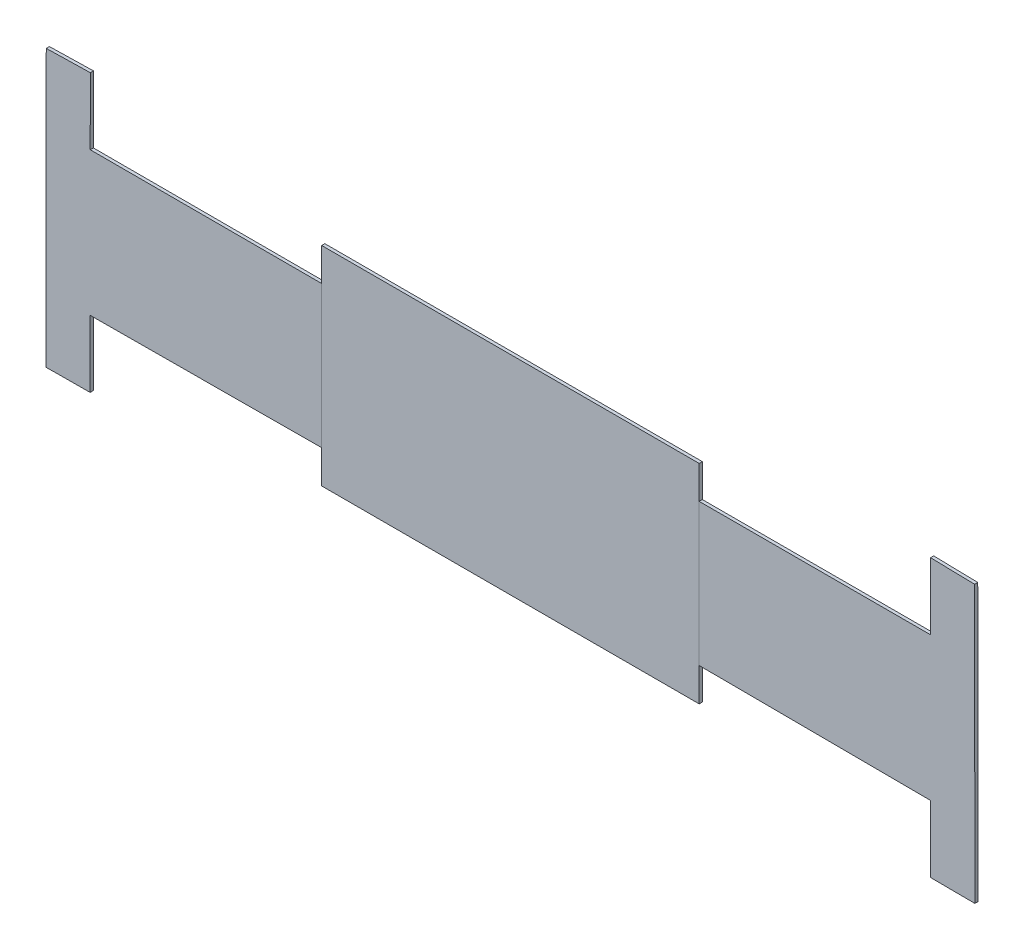
ISO-10303-21;
HEADER;
FILE_DESCRIPTION(('STEP AP214'),'2;1');
FILE_NAME('part.step','',(''),(''),'','','');
FILE_SCHEMA(('AUTOMOTIVE_DESIGN { 1 0 10303 214 1 1 1 1 }'));
ENDSEC;
DATA;
#1=APPLICATION_CONTEXT('core data for automotive mechanical design processes');
#2=APPLICATION_PROTOCOL_DEFINITION('international standard','automotive_design',2000,#1);
#3=PRODUCT_CONTEXT('',#1,'mechanical');
#4=PRODUCT('Part','Part','',(#3));
#5=PRODUCT_RELATED_PRODUCT_CATEGORY('part','',(#4));
#6=PRODUCT_DEFINITION_FORMATION('','',#4);
#7=PRODUCT_DEFINITION_CONTEXT('part definition',#1,'design');
#8=PRODUCT_DEFINITION('design','',#6,#7);
#9=PRODUCT_DEFINITION_SHAPE('','',#8);
#10=(LENGTH_UNIT() NAMED_UNIT(*) SI_UNIT(.MILLI.,.METRE.));
#11=(NAMED_UNIT(*) PLANE_ANGLE_UNIT() SI_UNIT($,.RADIAN.));
#12=(NAMED_UNIT(*) SI_UNIT($,.STERADIAN.) SOLID_ANGLE_UNIT());
#13=UNCERTAINTY_MEASURE_WITH_UNIT(LENGTH_MEASURE(1.E-05),#10,'distance_accuracy_value','');
#14=(GEOMETRIC_REPRESENTATION_CONTEXT(3) GLOBAL_UNCERTAINTY_ASSIGNED_CONTEXT((#13)) GLOBAL_UNIT_ASSIGNED_CONTEXT((#10,
#11,#12)) REPRESENTATION_CONTEXT('',''));
#15=CARTESIAN_POINT('',(0.,0.,0.));
#16=DIRECTION('',(0.,0.,1.));
#17=DIRECTION('',(1.,0.,0.));
#18=AXIS2_PLACEMENT_3D('',#15,#16,#17);
#19=CARTESIAN_POINT('',(191.496220464674,114.960867692272,87.1391620917928));
#20=DIRECTION('',(-0.99999957981213,-0.000916720002634513,0.));
#21=DIRECTION('',(0.000916720002634513,-0.99999957981213,0.));
#22=AXIS2_PLACEMENT_3D('',#19,#20,#21);
#23=PLANE('',#22);
#24=DIRECTION('',(-0.000916720002634517,0.99999957981213,0.));
#25=VECTOR('',#24,1.);
#26=CARTESIAN_POINT('',(191.496220464674,114.960867692272,86.1391620917928));
#27=LINE('',#26,#25);
#28=CARTESIAN_POINT('',(191.576741023194,27.1254059870341,86.1391620917928));
#29=VERTEX_POINT('',#28);
#30=CARTESIAN_POINT('',(191.496220464674,114.960867692272,86.1391620917928));
#31=VERTEX_POINT('',#30);
#32=EDGE_CURVE('P0_E111',#29,#31,#27,.T.);
#33=ORIENTED_EDGE('',*,*,#32,.T.);
#34=DIRECTION('',(0.,0.,-1.));
#35=VECTOR('',#34,1.);
#36=CARTESIAN_POINT('',(191.496220464674,114.960867692272,87.1391620917928));
#37=LINE('',#36,#35);
#38=CARTESIAN_POINT('',(191.496220464674,114.960867692272,87.1391620917928));
#39=VERTEX_POINT('',#38);
#40=EDGE_CURVE('P0_E10',#39,#31,#37,.T.);
#41=ORIENTED_EDGE('',*,*,#40,.F.);
#42=DIRECTION('',(-0.000916720002634517,0.99999957981213,0.));
#43=VECTOR('',#42,1.);
#44=CARTESIAN_POINT('',(191.496220464674,114.960867692272,87.1391620917928));
#45=LINE('',#44,#43);
#46=CARTESIAN_POINT('',(191.576741023194,27.1254059870341,87.1391620917928));
#47=VERTEX_POINT('',#46);
#48=EDGE_CURVE('P0_E125',#47,#39,#45,.T.);
#49=ORIENTED_EDGE('',*,*,#48,.F.);
#50=DIRECTION('',(0.,0.,-1.));
#51=VECTOR('',#50,1.);
#52=CARTESIAN_POINT('',(191.576741023194,27.1254059870341,87.1391620917928));
#53=LINE('',#52,#51);
#54=EDGE_CURVE('P0_E107',#47,#29,#53,.T.);
#55=ORIENTED_EDGE('',*,*,#54,.T.);
#56=EDGE_LOOP('',(#33,#41,#49,#55));
#57=FACE_BOUND('',#56,.T.);
#58=ADVANCED_FACE('P0_F15',(#57),#23,.F.);
#59=CARTESIAN_POINT('',(191.496220464674,114.960867692272,87.1391620917928));
#60=DIRECTION('',(-0.0225589289900871,-0.999745514980097,0.));
#61=DIRECTION('',(0.999745514980098,-0.0225589289900871,0.));
#62=AXIS2_PLACEMENT_3D('',#59,#60,#61);
#63=PLANE('',#62);
#64=DIRECTION('',(-0.999745514980097,0.0225589289900871,0.));
#65=VECTOR('',#64,1.);
#66=CARTESIAN_POINT('',(191.496220464674,114.960867692272,86.1391620917928));
#67=LINE('',#66,#65);
#68=CARTESIAN_POINT('',(177.501190790055,115.276660937566,86.1391620917928));
#69=VERTEX_POINT('',#68);
#70=EDGE_CURVE('P0_E114',#31,#69,#67,.T.);
#71=ORIENTED_EDGE('',*,*,#70,.T.);
#72=DIRECTION('',(0.,0.,-1.));
#73=VECTOR('',#72,1.);
#74=CARTESIAN_POINT('',(177.501190790055,115.276660937566,87.1391620917928));
#75=LINE('',#74,#73);
#76=CARTESIAN_POINT('',(177.501190790055,115.276660937566,87.1391620917928));
#77=VERTEX_POINT('',#76);
#78=EDGE_CURVE('P0_E23',#77,#69,#75,.T.);
#79=ORIENTED_EDGE('',*,*,#78,.F.);
#80=DIRECTION('',(-0.999745514980097,0.0225589289900871,0.));
#81=VECTOR('',#80,1.);
#82=CARTESIAN_POINT('',(191.496220464674,114.960867692272,87.1391620917928));
#83=LINE('',#82,#81);
#84=EDGE_CURVE('P0_E74',#39,#77,#83,.T.);
#85=ORIENTED_EDGE('',*,*,#84,.F.);
#86=ORIENTED_EDGE('',*,*,#40,.T.);
#87=EDGE_LOOP('',(#71,#79,#85,#86));
#88=FACE_BOUND('',#87,.T.);
#89=ADVANCED_FACE('P0_F160',(#88),#63,.F.);
#90=CARTESIAN_POINT('',(177.501190790055,115.276660937566,87.1391620917928));
#91=DIRECTION('',(0.999999850002585,0.000547717817411489,0.));
#92=DIRECTION('',(-0.000547717817411489,0.999999850002585,0.));
#93=AXIS2_PLACEMENT_3D('',#90,#91,#92);
#94=PLANE('',#93);
#95=DIRECTION('',(0.000547717817411492,-0.999999850002585,0.));
#96=VECTOR('',#95,1.);
#97=CARTESIAN_POINT('',(177.501190790055,115.276660937566,86.1391620917928));
#98=LINE('',#97,#96);
#99=CARTESIAN_POINT('',(177.512817781832,94.0485948365083,86.1391620917928));
#100=VERTEX_POINT('',#99);
#101=EDGE_CURVE('P0_E116',#69,#100,#98,.T.);
#102=ORIENTED_EDGE('',*,*,#101,.T.);
#103=DIRECTION('',(0.,0.,-1.));
#104=VECTOR('',#103,1.);
#105=CARTESIAN_POINT('',(177.512817781832,94.0485948365083,87.1391620917928));
#106=LINE('',#105,#104);
#107=CARTESIAN_POINT('',(177.512817781832,94.0485948365083,87.1391620917928));
#108=VERTEX_POINT('',#107);
#109=EDGE_CURVE('P0_E132',#108,#100,#106,.T.);
#110=ORIENTED_EDGE('',*,*,#109,.F.);
#111=DIRECTION('',(0.000547717817411492,-0.999999850002585,0.));
#112=VECTOR('',#111,1.);
#113=CARTESIAN_POINT('',(177.501190790055,115.276660937566,87.1391620917928));
#114=LINE('',#113,#112);
#115=EDGE_CURVE('P0_E140',#77,#108,#114,.T.);
#116=ORIENTED_EDGE('',*,*,#115,.F.);
#117=ORIENTED_EDGE('',*,*,#78,.T.);
#118=EDGE_LOOP('',(#102,#110,#116,#117));
#119=FACE_BOUND('',#118,.T.);
#120=ADVANCED_FACE('P0_F138',(#119),#94,.F.);
#121=CARTESIAN_POINT('',(177.512817781832,94.0485948365083,87.1391620917928));
#122=DIRECTION('',(0.000547717817411621,-0.999999850002585,0.));
#123=DIRECTION('',(0.999999850002585,0.000547717817411621,0.));
#124=AXIS2_PLACEMENT_3D('',#121,#122,#123);
#125=PLANE('',#124);
#126=DIRECTION('',(-0.999999850002585,-0.000547717817411621,0.));
#127=VECTOR('',#126,1.);
#128=CARTESIAN_POINT('',(177.512817781832,94.0485948365083,86.1391620917928));
#129=LINE('',#128,#127);
#130=CARTESIAN_POINT('',(103.929383931383,94.0082918726768,86.1391620917928));
#131=VERTEX_POINT('',#130);
#132=EDGE_CURVE('P0_E118',#100,#131,#129,.T.);
#133=ORIENTED_EDGE('',*,*,#132,.T.);
#134=DIRECTION('',(0.,0.,-1.));
#135=VECTOR('',#134,1.);
#136=CARTESIAN_POINT('',(103.929383931383,94.0082918726768,87.1391620917928));
#137=LINE('',#136,#135);
#138=CARTESIAN_POINT('',(103.929383931383,94.0082918726768,87.1391620917928));
#139=VERTEX_POINT('',#138);
#140=EDGE_CURVE('P0_E129',#139,#131,#137,.T.);
#141=ORIENTED_EDGE('',*,*,#140,.F.);
#142=DIRECTION('',(-0.999999850002585,-0.000547717817411621,0.));
#143=VECTOR('',#142,1.);
#144=CARTESIAN_POINT('',(177.512817781832,94.0485948365083,87.1391620917928));
#145=LINE('',#144,#143);
#146=EDGE_CURVE('P0_E152',#108,#139,#145,.T.);
#147=ORIENTED_EDGE('',*,*,#146,.F.);
#148=ORIENTED_EDGE('',*,*,#109,.T.);
#149=EDGE_LOOP('',(#133,#141,#147,#148));
#150=FACE_BOUND('',#149,.T.);
#151=ADVANCED_FACE('P0_F148',(#150),#125,.F.);
#152=CARTESIAN_POINT('',(103.929383931383,48.813255757817,87.1391620917928));
#153=DIRECTION('',(1.,0.,0.));
#154=DIRECTION('',(0.,1.,0.));
#155=AXIS2_PLACEMENT_3D('',#152,#153,#154);
#156=PLANE('',#155);
#157=DIRECTION('',(0.,-1.,0.));
#158=VECTOR('',#157,1.);
#159=CARTESIAN_POINT('',(103.929383931383,48.813255757817,86.1391620917928));
#160=LINE('',#159,#158);
#161=CARTESIAN_POINT('',(103.929383931383,48.813255757817,86.1391620917928));
#162=VERTEX_POINT('',#161);
#163=EDGE_CURVE('P0_E120',#131,#162,#160,.T.);
#164=ORIENTED_EDGE('',*,*,#163,.T.);
#165=DIRECTION('',(0.,0.,-1.));
#166=VECTOR('',#165,1.);
#167=CARTESIAN_POINT('',(103.929383931383,48.813255757817,87.1391620917928));
#168=LINE('',#167,#166);
#169=CARTESIAN_POINT('',(103.929383931383,48.813255757817,87.1391620917928));
#170=VERTEX_POINT('',#169);
#171=EDGE_CURVE('P0_E102',#170,#162,#168,.T.);
#172=ORIENTED_EDGE('',*,*,#171,.F.);
#173=DIRECTION('',(0.,-1.,0.));
#174=VECTOR('',#173,1.);
#175=CARTESIAN_POINT('',(103.929383931383,48.813255757817,87.1391620917928));
#176=LINE('',#175,#174);
#177=EDGE_CURVE('P0_E93',#139,#170,#176,.T.);
#178=ORIENTED_EDGE('',*,*,#177,.F.);
#179=ORIENTED_EDGE('',*,*,#140,.T.);
#180=EDGE_LOOP('',(#164,#172,#178,#179));
#181=FACE_BOUND('',#180,.T.);
#182=ADVANCED_FACE('P0_F151',(#181),#156,.F.);
#183=CARTESIAN_POINT('',(177.511900365374,48.4436116131279,87.1391620917928));
#184=DIRECTION('',(0.00502346886929363,0.999987382300657,0.));
#185=DIRECTION('',(-0.999987382300657,0.00502346886929363,0.));
#186=AXIS2_PLACEMENT_3D('',#183,#184,#185);
#187=PLANE('',#186);
#188=DIRECTION('',(0.999987382300657,-0.00502346886929364,0.));
#189=VECTOR('',#188,1.);
#190=CARTESIAN_POINT('',(177.511900365374,48.4436116131279,86.1391620917928));
#191=LINE('',#190,#189);
#192=CARTESIAN_POINT('',(177.511900365374,48.4436116131279,86.1391620917928));
#193=VERTEX_POINT('',#192);
#194=EDGE_CURVE('P0_E101',#162,#193,#191,.T.);
#195=ORIENTED_EDGE('',*,*,#194,.T.);
#196=DIRECTION('',(0.,0.,-1.));
#197=VECTOR('',#196,1.);
#198=CARTESIAN_POINT('',(177.511900365374,48.4436116131279,87.1391620917928));
#199=LINE('',#198,#197);
#200=CARTESIAN_POINT('',(177.511900365374,48.4436116131279,87.1391620917928));
#201=VERTEX_POINT('',#200);
#202=EDGE_CURVE('P0_E98',#201,#193,#199,.T.);
#203=ORIENTED_EDGE('',*,*,#202,.F.);
#204=DIRECTION('',(0.999987382300657,-0.00502346886929364,0.));
#205=VECTOR('',#204,1.);
#206=CARTESIAN_POINT('',(177.511900365374,48.4436116131279,87.1391620917928));
#207=LINE('',#206,#205);
#208=EDGE_CURVE('P0_E87',#170,#201,#207,.T.);
#209=ORIENTED_EDGE('',*,*,#208,.F.);
#210=ORIENTED_EDGE('',*,*,#171,.T.);
#211=EDGE_LOOP('',(#195,#203,#209,#210));
#212=FACE_BOUND('',#211,.T.);
#213=ADVANCED_FACE('P0_F99',(#212),#187,.F.);
#214=CARTESIAN_POINT('',(177.511900365374,48.4436116131279,87.1391620917928));
#215=DIRECTION('',(0.999998836837268,0.00152522919924042,0.));
#216=DIRECTION('',(-0.00152522919924043,0.999998836837269,0.));
#217=AXIS2_PLACEMENT_3D('',#214,#215,#216);
#218=PLANE('',#217);
#219=DIRECTION('',(0.00152522919924042,-0.999998836837269,0.));
#220=VECTOR('',#219,1.);
#221=CARTESIAN_POINT('',(177.511900365374,48.4436116131279,86.1391620917928));
#222=LINE('',#221,#220);
#223=CARTESIAN_POINT('',(177.544278036491,27.2155670196134,86.1391620917928));
#224=VERTEX_POINT('',#223);
#225=EDGE_CURVE('P0_E60',#193,#224,#222,.T.);
#226=ORIENTED_EDGE('',*,*,#225,.T.);
#227=DIRECTION('',(0.,0.,-1.));
#228=VECTOR('',#227,1.);
#229=CARTESIAN_POINT('',(177.544278036491,27.2155670196134,87.1391620917928));
#230=LINE('',#229,#228);
#231=CARTESIAN_POINT('',(177.544278036491,27.2155670196134,87.1391620917928));
#232=VERTEX_POINT('',#231);
#233=EDGE_CURVE('P0_E103',#232,#224,#230,.T.);
#234=ORIENTED_EDGE('',*,*,#233,.F.);
#235=DIRECTION('',(0.00152522919924042,-0.999998836837269,0.));
#236=VECTOR('',#235,1.);
#237=CARTESIAN_POINT('',(177.511900365374,48.4436116131279,87.1391620917928));
#238=LINE('',#237,#236);
#239=EDGE_CURVE('P0_E91',#201,#232,#238,.T.);
#240=ORIENTED_EDGE('',*,*,#239,.F.);
#241=ORIENTED_EDGE('',*,*,#202,.T.);
#242=EDGE_LOOP('',(#226,#234,#240,#241));
#243=FACE_BOUND('',#242,.T.);
#244=ADVANCED_FACE('P0_F105',(#243),#218,.F.);
#245=CARTESIAN_POINT('',(191.576741023194,27.1254059870341,87.1391620917928));
#246=DIRECTION('',(0.00642504253665458,0.99997935920118,0.));
#247=DIRECTION('',(-0.99997935920118,0.00642504253665458,0.));
#248=AXIS2_PLACEMENT_3D('',#245,#246,#247);
#249=PLANE('',#248);
#250=DIRECTION('',(0.99997935920118,-0.00642504253665458,0.));
#251=VECTOR('',#250,1.);
#252=CARTESIAN_POINT('',(191.576741023194,27.1254059870341,86.1391620917928));
#253=LINE('',#252,#251);
#254=EDGE_CURVE('P0_E66',#224,#29,#253,.T.);
#255=ORIENTED_EDGE('',*,*,#254,.T.);
#256=ORIENTED_EDGE('',*,*,#54,.F.);
#257=DIRECTION('',(0.99997935920118,-0.00642504253665458,0.));
#258=VECTOR('',#257,1.);
#259=CARTESIAN_POINT('',(191.576741023194,27.1254059870341,87.1391620917928));
#260=LINE('',#259,#258);
#261=EDGE_CURVE('P0_E31',#232,#47,#260,.T.);
#262=ORIENTED_EDGE('',*,*,#261,.F.);
#263=ORIENTED_EDGE('',*,*,#233,.T.);
#264=EDGE_LOOP('',(#255,#256,#262,#263));
#265=FACE_BOUND('',#264,.T.);
#266=ADVANCED_FACE('P0_F177',(#265),#249,.F.);
#267=CARTESIAN_POINT('',(163.847905712595,60.9702408178997,87.1391620917928));
#268=DIRECTION('',(0.,0.,-1.));
#269=DIRECTION('',(-0.999711247450155,-0.0240296009466376,0.));
#270=AXIS2_PLACEMENT_3D('',#267,#268,#269);
#271=PLANE('',#270);
#272=ORIENTED_EDGE('',*,*,#48,.T.);
#273=ORIENTED_EDGE('',*,*,#84,.T.);
#274=ORIENTED_EDGE('',*,*,#115,.T.);
#275=ORIENTED_EDGE('',*,*,#146,.T.);
#276=ORIENTED_EDGE('',*,*,#177,.T.);
#277=ORIENTED_EDGE('',*,*,#208,.T.);
#278=ORIENTED_EDGE('',*,*,#239,.T.);
#279=ORIENTED_EDGE('',*,*,#261,.T.);
#280=EDGE_LOOP('',(#272,#273,#274,#275,#276,#277,#278,#279));
#281=FACE_BOUND('',#280,.T.);
#282=ADVANCED_FACE('P0_F89',(#281),#271,.F.);
#283=CARTESIAN_POINT('',(163.847905712595,60.9702408178997,86.1391620917928));
#284=DIRECTION('',(0.,0.,-1.));
#285=DIRECTION('',(-0.999711247450155,-0.0240296009466376,0.));
#286=AXIS2_PLACEMENT_3D('',#283,#284,#285);
#287=PLANE('',#286);
#288=ORIENTED_EDGE('',*,*,#32,.F.);
#289=ORIENTED_EDGE('',*,*,#254,.F.);
#290=ORIENTED_EDGE('',*,*,#225,.F.);
#291=ORIENTED_EDGE('',*,*,#194,.F.);
#292=ORIENTED_EDGE('',*,*,#163,.F.);
#293=ORIENTED_EDGE('',*,*,#132,.F.);
#294=ORIENTED_EDGE('',*,*,#101,.F.);
#295=ORIENTED_EDGE('',*,*,#70,.F.);
#296=EDGE_LOOP('',(#288,#289,#290,#291,#292,#293,#294,#295));
#297=FACE_BOUND('',#296,.T.);
#298=ADVANCED_FACE('P0_F144',(#297),#287,.T.);
#299=CLOSED_SHELL('',(#58,#89,#120,#151,#182,#213,#244,#266,#282,#298));
#300=MANIFOLD_SOLID_BREP('P0_B1',#299);
#301=CARTESIAN_POINT('',(-103.637452601907,114.933589519347,86.1391620917928));
#302=DIRECTION('',(0.99999957981213,-0.000916720002634517,0.));
#303=DIRECTION('',(-0.000916720002634517,-0.99999957981213,0.));
#304=AXIS2_PLACEMENT_3D('',#301,#302,#303);
#305=PLANE('',#304);
#306=DIRECTION('',(0.00091672000263452,0.99999957981213,0.));
#307=VECTOR('',#306,1.);
#308=CARTESIAN_POINT('',(-103.637452601907,114.933589519347,87.1391620917928));
#309=LINE('',#308,#307);
#310=CARTESIAN_POINT('',(-103.717973160427,27.098127814109,87.1391620917928));
#311=VERTEX_POINT('',#310);
#312=CARTESIAN_POINT('',(-103.637452601907,114.933589519347,87.1391620917928));
#313=VERTEX_POINT('',#312);
#314=EDGE_CURVE('P1_E112',#311,#313,#309,.T.);
#315=ORIENTED_EDGE('',*,*,#314,.T.);
#316=DIRECTION('',(0.,0.,1.));
#317=VECTOR('',#316,1.);
#318=CARTESIAN_POINT('',(-103.637452601907,114.933589519347,86.1391620917928));
#319=LINE('',#318,#317);
#320=CARTESIAN_POINT('',(-103.637452601907,114.933589519347,86.1391620917928));
#321=VERTEX_POINT('',#320);
#322=EDGE_CURVE('P1_E11',#321,#313,#319,.T.);
#323=ORIENTED_EDGE('',*,*,#322,.F.);
#324=DIRECTION('',(0.00091672000263452,0.99999957981213,0.));
#325=VECTOR('',#324,1.);
#326=CARTESIAN_POINT('',(-103.637452601907,114.933589519347,86.1391620917928));
#327=LINE('',#326,#325);
#328=CARTESIAN_POINT('',(-103.717973160427,27.098127814109,86.1391620917928));
#329=VERTEX_POINT('',#328);
#330=EDGE_CURVE('P1_E126',#329,#321,#327,.T.);
#331=ORIENTED_EDGE('',*,*,#330,.F.);
#332=DIRECTION('',(0.,0.,1.));
#333=VECTOR('',#332,1.);
#334=CARTESIAN_POINT('',(-103.717973160427,27.098127814109,86.1391620917928));
#335=LINE('',#334,#333);
#336=EDGE_CURVE('P1_E108',#329,#311,#335,.T.);
#337=ORIENTED_EDGE('',*,*,#336,.T.);
#338=EDGE_LOOP('',(#315,#323,#331,#337));
#339=FACE_BOUND('',#338,.T.);
#340=ADVANCED_FACE('P1_F16',(#339),#305,.F.);
#341=CARTESIAN_POINT('',(-103.637452601907,114.933589519347,86.1391620917928));
#342=DIRECTION('',(0.0225589289900871,-0.999745514980097,0.));
#343=DIRECTION('',(-0.999745514980098,-0.0225589289900871,0.));
#344=AXIS2_PLACEMENT_3D('',#341,#342,#343);
#345=PLANE('',#344);
#346=DIRECTION('',(0.999745514980097,0.0225589289900871,0.));
#347=VECTOR('',#346,1.);
#348=CARTESIAN_POINT('',(-103.637452601907,114.933589519347,87.1391620917928));
#349=LINE('',#348,#347);
#350=CARTESIAN_POINT('',(-89.642422927288,115.249382764641,87.1391620917928));
#351=VERTEX_POINT('',#350);
#352=EDGE_CURVE('P1_E115',#313,#351,#349,.T.);
#353=ORIENTED_EDGE('',*,*,#352,.T.);
#354=DIRECTION('',(0.,0.,1.));
#355=VECTOR('',#354,1.);
#356=CARTESIAN_POINT('',(-89.642422927288,115.249382764641,86.1391620917928));
#357=LINE('',#356,#355);
#358=CARTESIAN_POINT('',(-89.642422927288,115.249382764641,86.1391620917928));
#359=VERTEX_POINT('',#358);
#360=EDGE_CURVE('P1_E24',#359,#351,#357,.T.);
#361=ORIENTED_EDGE('',*,*,#360,.F.);
#362=DIRECTION('',(0.999745514980097,0.0225589289900871,0.));
#363=VECTOR('',#362,1.);
#364=CARTESIAN_POINT('',(-103.637452601907,114.933589519347,86.1391620917928));
#365=LINE('',#364,#363);
#366=EDGE_CURVE('P1_E75',#321,#359,#365,.T.);
#367=ORIENTED_EDGE('',*,*,#366,.F.);
#368=ORIENTED_EDGE('',*,*,#322,.T.);
#369=EDGE_LOOP('',(#353,#361,#367,#368));
#370=FACE_BOUND('',#369,.T.);
#371=ADVANCED_FACE('P1_F161',(#370),#345,.F.);
#372=CARTESIAN_POINT('',(-89.642422927288,115.249382764641,86.1391620917928));
#373=DIRECTION('',(-0.999999850002585,0.000547717817411496,0.));
#374=DIRECTION('',(0.000547717817411496,0.999999850002585,0.));
#375=AXIS2_PLACEMENT_3D('',#372,#373,#374);
#376=PLANE('',#375);
#377=DIRECTION('',(-0.000547717817411499,-0.999999850002585,0.));
#378=VECTOR('',#377,1.);
#379=CARTESIAN_POINT('',(-89.642422927288,115.249382764641,87.1391620917928));
#380=LINE('',#379,#378);
#381=CARTESIAN_POINT('',(-89.6540499190647,94.0213166635832,87.1391620917928));
#382=VERTEX_POINT('',#381);
#383=EDGE_CURVE('P1_E117',#351,#382,#380,.T.);
#384=ORIENTED_EDGE('',*,*,#383,.T.);
#385=DIRECTION('',(0.,0.,1.));
#386=VECTOR('',#385,1.);
#387=CARTESIAN_POINT('',(-89.6540499190647,94.0213166635832,86.1391620917928));
#388=LINE('',#387,#386);
#389=CARTESIAN_POINT('',(-89.6540499190647,94.0213166635832,86.1391620917928));
#390=VERTEX_POINT('',#389);
#391=EDGE_CURVE('P1_E133',#390,#382,#388,.T.);
#392=ORIENTED_EDGE('',*,*,#391,.F.);
#393=DIRECTION('',(-0.000547717817411499,-0.999999850002585,0.));
#394=VECTOR('',#393,1.);
#395=CARTESIAN_POINT('',(-89.642422927288,115.249382764641,86.1391620917928));
#396=LINE('',#395,#394);
#397=EDGE_CURVE('P1_E141',#359,#390,#396,.T.);
#398=ORIENTED_EDGE('',*,*,#397,.F.);
#399=ORIENTED_EDGE('',*,*,#360,.T.);
#400=EDGE_LOOP('',(#384,#392,#398,#399));
#401=FACE_BOUND('',#400,.T.);
#402=ADVANCED_FACE('P1_F139',(#401),#376,.F.);
#403=CARTESIAN_POINT('',(-89.6540499190647,94.0213166635832,86.1391620917928));
#404=DIRECTION('',(-0.000547717817411628,-0.999999850002585,0.));
#405=DIRECTION('',(-0.999999850002585,0.000547717817411628,0.));
#406=AXIS2_PLACEMENT_3D('',#403,#404,#405);
#407=PLANE('',#406);
#408=DIRECTION('',(0.999999850002585,-0.000547717817411628,0.));
#409=VECTOR('',#408,1.);
#410=CARTESIAN_POINT('',(-89.6540499190647,94.0213166635832,87.1391620917928));
#411=LINE('',#410,#409);
#412=CARTESIAN_POINT('',(-16.0706160686165,93.9810136997517,87.1391620917928));
#413=VERTEX_POINT('',#412);
#414=EDGE_CURVE('P1_E119',#382,#413,#411,.T.);
#415=ORIENTED_EDGE('',*,*,#414,.T.);
#416=DIRECTION('',(0.,0.,1.));
#417=VECTOR('',#416,1.);
#418=CARTESIAN_POINT('',(-16.0706160686165,93.9810136997517,86.1391620917928));
#419=LINE('',#418,#417);
#420=CARTESIAN_POINT('',(-16.0706160686165,93.9810136997517,86.1391620917928));
#421=VERTEX_POINT('',#420);
#422=EDGE_CURVE('P1_E130',#421,#413,#419,.T.);
#423=ORIENTED_EDGE('',*,*,#422,.F.);
#424=DIRECTION('',(0.999999850002585,-0.000547717817411628,0.));
#425=VECTOR('',#424,1.);
#426=CARTESIAN_POINT('',(-89.6540499190647,94.0213166635832,86.1391620917928));
#427=LINE('',#426,#425);
#428=EDGE_CURVE('P1_E153',#390,#421,#427,.T.);
#429=ORIENTED_EDGE('',*,*,#428,.F.);
#430=ORIENTED_EDGE('',*,*,#391,.T.);
#431=EDGE_LOOP('',(#415,#423,#429,#430));
#432=FACE_BOUND('',#431,.T.);
#433=ADVANCED_FACE('P1_F149',(#432),#407,.F.);
#434=CARTESIAN_POINT('',(-16.0706160686165,48.7859775848919,86.1391620917928));
#435=DIRECTION('',(-1.,0.,0.));
#436=DIRECTION('',(0.,1.,0.));
#437=AXIS2_PLACEMENT_3D('',#434,#435,#436);
#438=PLANE('',#437);
#439=DIRECTION('',(0.,-1.,0.));
#440=VECTOR('',#439,1.);
#441=CARTESIAN_POINT('',(-16.0706160686165,48.7859775848919,87.1391620917928));
#442=LINE('',#441,#440);
#443=CARTESIAN_POINT('',(-16.0706160686165,48.7859775848919,87.1391620917928));
#444=VERTEX_POINT('',#443);
#445=EDGE_CURVE('P1_E121',#413,#444,#442,.T.);
#446=ORIENTED_EDGE('',*,*,#445,.T.);
#447=DIRECTION('',(0.,0.,1.));
#448=VECTOR('',#447,1.);
#449=CARTESIAN_POINT('',(-16.0706160686165,48.7859775848919,86.1391620917928));
#450=LINE('',#449,#448);
#451=CARTESIAN_POINT('',(-16.0706160686165,48.7859775848919,86.1391620917928));
#452=VERTEX_POINT('',#451);
#453=EDGE_CURVE('P1_E103',#452,#444,#450,.T.);
#454=ORIENTED_EDGE('',*,*,#453,.F.);
#455=DIRECTION('',(0.,-1.,0.));
#456=VECTOR('',#455,1.);
#457=CARTESIAN_POINT('',(-16.0706160686165,48.7859775848919,86.1391620917928));
#458=LINE('',#457,#456);
#459=EDGE_CURVE('P1_E94',#421,#452,#458,.T.);
#460=ORIENTED_EDGE('',*,*,#459,.F.);
#461=ORIENTED_EDGE('',*,*,#422,.T.);
#462=EDGE_LOOP('',(#446,#454,#460,#461));
#463=FACE_BOUND('',#462,.T.);
#464=ADVANCED_FACE('P1_F152',(#463),#438,.F.);
#465=CARTESIAN_POINT('',(-89.653132502607,48.4163334402028,86.1391620917928));
#466=DIRECTION('',(-0.00502346886929363,0.999987382300657,0.));
#467=DIRECTION('',(0.999987382300657,0.00502346886929363,0.));
#468=AXIS2_PLACEMENT_3D('',#465,#466,#467);
#469=PLANE('',#468);
#470=DIRECTION('',(-0.999987382300656,-0.00502346886929363,0.));
#471=VECTOR('',#470,1.);
#472=CARTESIAN_POINT('',(-89.653132502607,48.4163334402028,87.1391620917928));
#473=LINE('',#472,#471);
#474=CARTESIAN_POINT('',(-89.653132502607,48.4163334402028,87.1391620917928));
#475=VERTEX_POINT('',#474);
#476=EDGE_CURVE('P1_E102',#444,#475,#473,.T.);
#477=ORIENTED_EDGE('',*,*,#476,.T.);
#478=DIRECTION('',(0.,0.,1.));
#479=VECTOR('',#478,1.);
#480=CARTESIAN_POINT('',(-89.653132502607,48.4163334402028,86.1391620917928));
#481=LINE('',#480,#479);
#482=CARTESIAN_POINT('',(-89.653132502607,48.4163334402028,86.1391620917928));
#483=VERTEX_POINT('',#482);
#484=EDGE_CURVE('P1_E99',#483,#475,#481,.T.);
#485=ORIENTED_EDGE('',*,*,#484,.F.);
#486=DIRECTION('',(-0.999987382300656,-0.00502346886929363,0.));
#487=VECTOR('',#486,1.);
#488=CARTESIAN_POINT('',(-89.653132502607,48.4163334402028,86.1391620917928));
#489=LINE('',#488,#487);
#490=EDGE_CURVE('P1_E88',#452,#483,#489,.T.);
#491=ORIENTED_EDGE('',*,*,#490,.F.);
#492=ORIENTED_EDGE('',*,*,#453,.T.);
#493=EDGE_LOOP('',(#477,#485,#491,#492));
#494=FACE_BOUND('',#493,.T.);
#495=ADVANCED_FACE('P1_F100',(#494),#469,.F.);
#496=CARTESIAN_POINT('',(-89.653132502607,48.4163334402028,86.1391620917928));
#497=DIRECTION('',(-0.999998836837268,0.00152522919924043,0.));
#498=DIRECTION('',(0.00152522919924043,0.999998836837269,0.));
#499=AXIS2_PLACEMENT_3D('',#496,#497,#498);
#500=PLANE('',#499);
#501=DIRECTION('',(-0.00152522919924043,-0.999998836837269,0.));
#502=VECTOR('',#501,1.);
#503=CARTESIAN_POINT('',(-89.653132502607,48.4163334402028,87.1391620917928));
#504=LINE('',#503,#502);
#505=CARTESIAN_POINT('',(-89.6855101737243,27.1882888466883,87.1391620917928));
#506=VERTEX_POINT('',#505);
#507=EDGE_CURVE('P1_E61',#475,#506,#504,.T.);
#508=ORIENTED_EDGE('',*,*,#507,.T.);
#509=DIRECTION('',(0.,0.,1.));
#510=VECTOR('',#509,1.);
#511=CARTESIAN_POINT('',(-89.6855101737243,27.1882888466883,86.1391620917928));
#512=LINE('',#511,#510);
#513=CARTESIAN_POINT('',(-89.6855101737243,27.1882888466883,86.1391620917928));
#514=VERTEX_POINT('',#513);
#515=EDGE_CURVE('P1_E104',#514,#506,#512,.T.);
#516=ORIENTED_EDGE('',*,*,#515,.F.);
#517=DIRECTION('',(-0.00152522919924043,-0.999998836837269,0.));
#518=VECTOR('',#517,1.);
#519=CARTESIAN_POINT('',(-89.653132502607,48.4163334402028,86.1391620917928));
#520=LINE('',#519,#518);
#521=EDGE_CURVE('P1_E92',#483,#514,#520,.T.);
#522=ORIENTED_EDGE('',*,*,#521,.F.);
#523=ORIENTED_EDGE('',*,*,#484,.T.);
#524=EDGE_LOOP('',(#508,#516,#522,#523));
#525=FACE_BOUND('',#524,.T.);
#526=ADVANCED_FACE('P1_F106',(#525),#500,.F.);
#527=CARTESIAN_POINT('',(-103.717973160427,27.098127814109,86.1391620917928));
#528=DIRECTION('',(-0.00642504253665457,0.99997935920118,0.));
#529=DIRECTION('',(0.99997935920118,0.00642504253665457,0.));
#530=AXIS2_PLACEMENT_3D('',#527,#528,#529);
#531=PLANE('',#530);
#532=DIRECTION('',(-0.99997935920118,-0.00642504253665457,0.));
#533=VECTOR('',#532,1.);
#534=CARTESIAN_POINT('',(-103.717973160427,27.098127814109,87.1391620917928));
#535=LINE('',#534,#533);
#536=EDGE_CURVE('P1_E67',#506,#311,#535,.T.);
#537=ORIENTED_EDGE('',*,*,#536,.T.);
#538=ORIENTED_EDGE('',*,*,#336,.F.);
#539=DIRECTION('',(-0.99997935920118,-0.00642504253665457,0.));
#540=VECTOR('',#539,1.);
#541=CARTESIAN_POINT('',(-103.717973160427,27.098127814109,86.1391620917928));
#542=LINE('',#541,#540);
#543=EDGE_CURVE('P1_E32',#514,#329,#542,.T.);
#544=ORIENTED_EDGE('',*,*,#543,.F.);
#545=ORIENTED_EDGE('',*,*,#515,.T.);
#546=EDGE_LOOP('',(#537,#538,#544,#545));
#547=FACE_BOUND('',#546,.T.);
#548=ADVANCED_FACE('P1_F178',(#547),#531,.F.);
#549=CARTESIAN_POINT('',(-75.9891378498279,60.9429626449746,86.1391620917928));
#550=DIRECTION('',(0.,0.,1.));
#551=DIRECTION('',(0.999711247450155,-0.0240296009466376,0.));
#552=AXIS2_PLACEMENT_3D('',#549,#550,#551);
#553=PLANE('',#552);
#554=ORIENTED_EDGE('',*,*,#330,.T.);
#555=ORIENTED_EDGE('',*,*,#366,.T.);
#556=ORIENTED_EDGE('',*,*,#397,.T.);
#557=ORIENTED_EDGE('',*,*,#428,.T.);
#558=ORIENTED_EDGE('',*,*,#459,.T.);
#559=ORIENTED_EDGE('',*,*,#490,.T.);
#560=ORIENTED_EDGE('',*,*,#521,.T.);
#561=ORIENTED_EDGE('',*,*,#543,.T.);
#562=EDGE_LOOP('',(#554,#555,#556,#557,#558,#559,#560,#561));
#563=FACE_BOUND('',#562,.T.);
#564=ADVANCED_FACE('P1_F90',(#563),#553,.F.);
#565=CARTESIAN_POINT('',(-75.9891378498279,60.9429626449746,87.1391620917928));
#566=DIRECTION('',(0.,0.,1.));
#567=DIRECTION('',(0.999711247450155,-0.0240296009466376,0.));
#568=AXIS2_PLACEMENT_3D('',#565,#566,#567);
#569=PLANE('',#568);
#570=ORIENTED_EDGE('',*,*,#314,.F.);
#571=ORIENTED_EDGE('',*,*,#536,.F.);
#572=ORIENTED_EDGE('',*,*,#507,.F.);
#573=ORIENTED_EDGE('',*,*,#476,.F.);
#574=ORIENTED_EDGE('',*,*,#445,.F.);
#575=ORIENTED_EDGE('',*,*,#414,.F.);
#576=ORIENTED_EDGE('',*,*,#383,.F.);
#577=ORIENTED_EDGE('',*,*,#352,.F.);
#578=EDGE_LOOP('',(#570,#571,#572,#573,#574,#575,#576,#577));
#579=FACE_BOUND('',#578,.T.);
#580=ADVANCED_FACE('P1_F145',(#579),#569,.T.);
#581=CLOSED_SHELL('',(#340,#371,#402,#433,#464,#495,#526,#548,#564,#580));
#582=MANIFOLD_SOLID_BREP('P1_B1',#581);
#583=CARTESIAN_POINT('',(103.929383931383,38.2392812998555,87.1391620917928));
#584=DIRECTION('',(0.,1.,0.));
#585=DIRECTION('',(-1.,0.,0.));
#586=AXIS2_PLACEMENT_3D('',#583,#584,#585);
#587=PLANE('',#586);
#588=DIRECTION('',(1.,0.,0.));
#589=VECTOR('',#588,1.);
#590=CARTESIAN_POINT('',(103.929383931383,38.2392812998555,86.1391620917928));
#591=LINE('',#590,#589);
#592=CARTESIAN_POINT('',(-16.0706160686165,38.2392812998555,86.1391620917928));
#593=VERTEX_POINT('',#592);
#594=CARTESIAN_POINT('',(103.929383931383,38.2392812998555,86.1391620917928));
#595=VERTEX_POINT('',#594);
#596=EDGE_CURVE('P2_E79',#593,#595,#591,.T.);
#597=ORIENTED_EDGE('',*,*,#596,.T.);
#598=DIRECTION('',(0.,0.,-1.));
#599=VECTOR('',#598,1.);
#600=CARTESIAN_POINT('',(103.929383931383,38.2392812998555,87.1391620917928));
#601=LINE('',#600,#599);
#602=CARTESIAN_POINT('',(103.929383931383,38.2392812998555,87.1391620917928));
#603=VERTEX_POINT('',#602);
#604=EDGE_CURVE('P2_E11',#603,#595,#601,.T.);
#605=ORIENTED_EDGE('',*,*,#604,.F.);
#606=DIRECTION('',(1.,0.,0.));
#607=VECTOR('',#606,1.);
#608=CARTESIAN_POINT('',(103.929383931383,38.2392812998555,87.1391620917928));
#609=LINE('',#608,#607);
#610=CARTESIAN_POINT('',(-16.0706160686165,38.2392812998555,87.1391620917928));
#611=VERTEX_POINT('',#610);
#612=EDGE_CURVE('P2_E67',#611,#603,#609,.T.);
#613=ORIENTED_EDGE('',*,*,#612,.F.);
#614=DIRECTION('',(0.,0.,-1.));
#615=VECTOR('',#614,1.);
#616=CARTESIAN_POINT('',(-16.0706160686165,38.2392812998555,87.1391620917928));
#617=LINE('',#616,#615);
#618=EDGE_CURVE('P2_E75',#611,#593,#617,.T.);
#619=ORIENTED_EDGE('',*,*,#618,.T.);
#620=EDGE_LOOP('',(#597,#605,#613,#619));
#621=FACE_BOUND('',#620,.T.);
#622=ADVANCED_FACE('P2_F16',(#621),#587,.F.);
#623=CARTESIAN_POINT('',(103.929383931383,104.453118155913,87.1391620917928));
#624=DIRECTION('',(-1.,0.,0.));
#625=DIRECTION('',(0.,0.,1.));
#626=AXIS2_PLACEMENT_3D('',#623,#624,#625);
#627=PLANE('',#626);
#628=DIRECTION('',(0.,1.,0.));
#629=VECTOR('',#628,1.);
#630=CARTESIAN_POINT('',(103.929383931383,104.453118155913,86.1391620917928));
#631=LINE('',#630,#629);
#632=CARTESIAN_POINT('',(103.929383931383,104.453118155913,86.1391620917928));
#633=VERTEX_POINT('',#632);
#634=EDGE_CURVE('P2_E71',#595,#633,#631,.T.);
#635=ORIENTED_EDGE('',*,*,#634,.T.);
#636=DIRECTION('',(0.,0.,-1.));
#637=VECTOR('',#636,1.);
#638=CARTESIAN_POINT('',(103.929383931383,104.453118155913,87.1391620917928));
#639=LINE('',#638,#637);
#640=CARTESIAN_POINT('',(103.929383931383,104.453118155913,87.1391620917928));
#641=VERTEX_POINT('',#640);
#642=EDGE_CURVE('P2_E24',#641,#633,#639,.T.);
#643=ORIENTED_EDGE('',*,*,#642,.F.);
#644=DIRECTION('',(0.,1.,0.));
#645=VECTOR('',#644,1.);
#646=CARTESIAN_POINT('',(103.929383931383,104.453118155913,87.1391620917928));
#647=LINE('',#646,#645);
#648=EDGE_CURVE('P2_E62',#603,#641,#647,.T.);
#649=ORIENTED_EDGE('',*,*,#648,.F.);
#650=ORIENTED_EDGE('',*,*,#604,.T.);
#651=EDGE_LOOP('',(#635,#643,#649,#650));
#652=FACE_BOUND('',#651,.T.);
#653=ADVANCED_FACE('P2_F70',(#652),#627,.F.);
#654=CARTESIAN_POINT('',(-16.0706160686165,104.453118155913,87.1391620917928));
#655=DIRECTION('',(0.,-1.,0.));
#656=DIRECTION('',(0.,0.,-1.));
#657=AXIS2_PLACEMENT_3D('',#654,#655,#656);
#658=PLANE('',#657);
#659=DIRECTION('',(-1.,0.,0.));
#660=VECTOR('',#659,1.);
#661=CARTESIAN_POINT('',(-16.0706160686165,104.453118155913,86.1391620917928));
#662=LINE('',#661,#660);
#663=CARTESIAN_POINT('',(-16.0706160686165,104.453118155913,86.1391620917928));
#664=VERTEX_POINT('',#663);
#665=EDGE_CURVE('P2_E49',#633,#664,#662,.T.);
#666=ORIENTED_EDGE('',*,*,#665,.T.);
#667=DIRECTION('',(0.,0.,-1.));
#668=VECTOR('',#667,1.);
#669=CARTESIAN_POINT('',(-16.0706160686165,104.453118155913,87.1391620917928));
#670=LINE('',#669,#668);
#671=CARTESIAN_POINT('',(-16.0706160686165,104.453118155913,87.1391620917928));
#672=VERTEX_POINT('',#671);
#673=EDGE_CURVE('P2_E72',#672,#664,#670,.T.);
#674=ORIENTED_EDGE('',*,*,#673,.F.);
#675=DIRECTION('',(-1.,0.,0.));
#676=VECTOR('',#675,1.);
#677=CARTESIAN_POINT('',(-16.0706160686165,104.453118155913,87.1391620917928));
#678=LINE('',#677,#676);
#679=EDGE_CURVE('P2_E65',#641,#672,#678,.T.);
#680=ORIENTED_EDGE('',*,*,#679,.F.);
#681=ORIENTED_EDGE('',*,*,#642,.T.);
#682=EDGE_LOOP('',(#666,#674,#680,#681));
#683=FACE_BOUND('',#682,.T.);
#684=ADVANCED_FACE('P2_F73',(#683),#658,.F.);
#685=CARTESIAN_POINT('',(-16.0706160686165,38.2392812998555,87.1391620917928));
#686=DIRECTION('',(1.,0.,0.));
#687=DIRECTION('',(0.,0.,-1.));
#688=AXIS2_PLACEMENT_3D('',#685,#686,#687);
#689=PLANE('',#688);
#690=DIRECTION('',(0.,-1.,0.));
#691=VECTOR('',#690,1.);
#692=CARTESIAN_POINT('',(-16.0706160686165,38.2392812998555,86.1391620917928));
#693=LINE('',#692,#691);
#694=EDGE_CURVE('P2_E55',#664,#593,#693,.T.);
#695=ORIENTED_EDGE('',*,*,#694,.T.);
#696=ORIENTED_EDGE('',*,*,#618,.F.);
#697=DIRECTION('',(0.,-1.,0.));
#698=VECTOR('',#697,1.);
#699=CARTESIAN_POINT('',(-16.0706160686165,38.2392812998555,87.1391620917928));
#700=LINE('',#699,#698);
#701=EDGE_CURVE('P2_E32',#672,#611,#700,.T.);
#702=ORIENTED_EDGE('',*,*,#701,.F.);
#703=ORIENTED_EDGE('',*,*,#673,.T.);
#704=EDGE_LOOP('',(#695,#696,#702,#703));
#705=FACE_BOUND('',#704,.T.);
#706=ADVANCED_FACE('P2_F86',(#705),#689,.F.);
#707=CARTESIAN_POINT('',(70.2982329609001,43.9840036457839,87.1391620917928));
#708=DIRECTION('',(0.,0.,-1.));
#709=DIRECTION('',(-1.,0.,0.));
#710=AXIS2_PLACEMENT_3D('',#707,#708,#709);
#711=PLANE('',#710);
#712=ORIENTED_EDGE('',*,*,#612,.T.);
#713=ORIENTED_EDGE('',*,*,#648,.T.);
#714=ORIENTED_EDGE('',*,*,#679,.T.);
#715=ORIENTED_EDGE('',*,*,#701,.T.);
#716=EDGE_LOOP('',(#712,#713,#714,#715));
#717=FACE_BOUND('',#716,.T.);
#718=ADVANCED_FACE('P2_F63',(#717),#711,.F.);
#719=CARTESIAN_POINT('',(70.2982329609001,43.9840036457839,86.1391620917928));
#720=DIRECTION('',(0.,0.,-1.));
#721=DIRECTION('',(-1.,0.,0.));
#722=AXIS2_PLACEMENT_3D('',#719,#720,#721);
#723=PLANE('',#722);
#724=ORIENTED_EDGE('',*,*,#596,.F.);
#725=ORIENTED_EDGE('',*,*,#694,.F.);
#726=ORIENTED_EDGE('',*,*,#665,.F.);
#727=ORIENTED_EDGE('',*,*,#634,.F.);
#728=EDGE_LOOP('',(#724,#725,#726,#727));
#729=FACE_BOUND('',#728,.T.);
#730=ADVANCED_FACE('P2_F89',(#729),#723,.T.);
#731=CLOSED_SHELL('',(#622,#653,#684,#706,#718,#730));
#732=MANIFOLD_SOLID_BREP('P2_B1',#731);
#733=ADVANCED_BREP_SHAPE_REPRESENTATION('',(#18,#300,#582,#732),#14);
#734=SHAPE_DEFINITION_REPRESENTATION(#9,#733);
ENDSEC;
END-ISO-10303-21;
